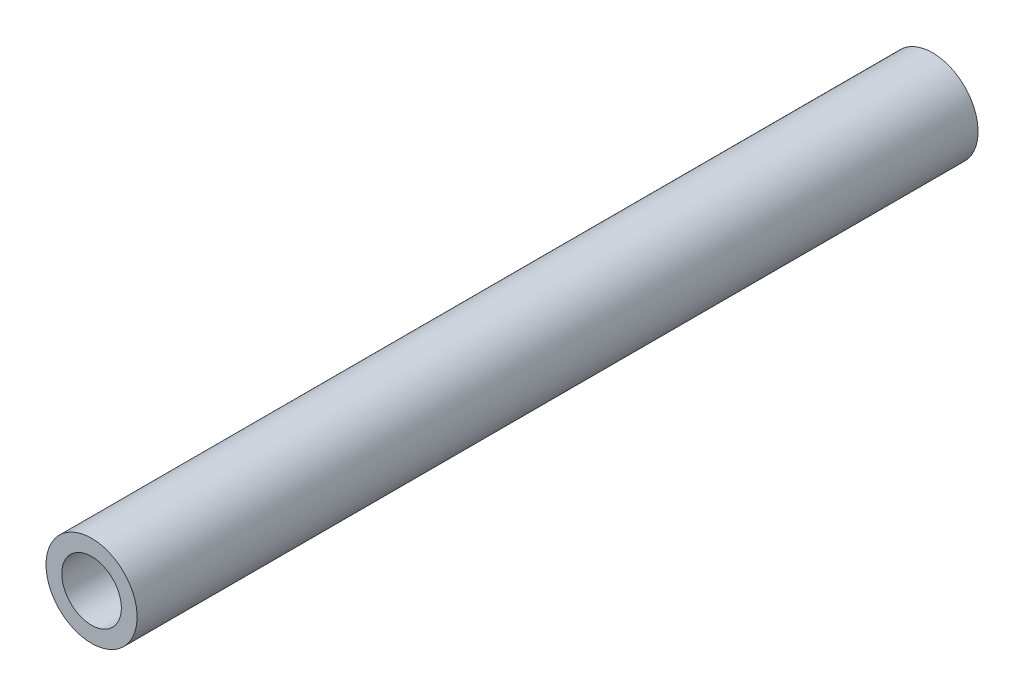
ISO-10303-21;
HEADER;
FILE_DESCRIPTION(('STEP AP214'),'2;1');
FILE_NAME('part.step','',(''),(''),'','','');
FILE_SCHEMA(('AUTOMOTIVE_DESIGN { 1 0 10303 214 1 1 1 1 }'));
ENDSEC;
DATA;
#1=APPLICATION_CONTEXT('core data for automotive mechanical design processes');
#2=APPLICATION_PROTOCOL_DEFINITION('international standard','automotive_design',2000,#1);
#3=PRODUCT_CONTEXT('',#1,'mechanical');
#4=PRODUCT('Part','Part','',(#3));
#5=PRODUCT_RELATED_PRODUCT_CATEGORY('part','',(#4));
#6=PRODUCT_DEFINITION_FORMATION('','',#4);
#7=PRODUCT_DEFINITION_CONTEXT('part definition',#1,'design');
#8=PRODUCT_DEFINITION('design','',#6,#7);
#9=PRODUCT_DEFINITION_SHAPE('','',#8);
#10=(LENGTH_UNIT() NAMED_UNIT(*) SI_UNIT(.MILLI.,.METRE.));
#11=(NAMED_UNIT(*) PLANE_ANGLE_UNIT() SI_UNIT($,.RADIAN.));
#12=(NAMED_UNIT(*) SI_UNIT($,.STERADIAN.) SOLID_ANGLE_UNIT());
#13=UNCERTAINTY_MEASURE_WITH_UNIT(LENGTH_MEASURE(1.E-05),#10,'distance_accuracy_value','');
#14=(GEOMETRIC_REPRESENTATION_CONTEXT(3) GLOBAL_UNCERTAINTY_ASSIGNED_CONTEXT((#13)) GLOBAL_UNIT_ASSIGNED_CONTEXT((#10,
#11,#12)) REPRESENTATION_CONTEXT('',''));
#15=CARTESIAN_POINT('',(0.,0.,0.));
#16=DIRECTION('',(0.,0.,1.));
#17=DIRECTION('',(1.,0.,0.));
#18=AXIS2_PLACEMENT_3D('',#15,#16,#17);
#19=CARTESIAN_POINT('',(0.,0.,304.8));
#20=DIRECTION('',(0.,0.,-1.));
#21=DIRECTION('',(-1.,0.,0.));
#22=AXIS2_PLACEMENT_3D('',#19,#20,#21);
#23=CYLINDRICAL_SURFACE('',#22,16.51);
#24=CARTESIAN_POINT('',(0.,0.,304.8));
#25=DIRECTION('',(0.,0.,1.));
#26=DIRECTION('',(1.,0.,0.));
#27=AXIS2_PLACEMENT_3D('',#24,#25,#26);
#28=CIRCLE('',#27,16.51);
#29=CARTESIAN_POINT('',(-16.51,0.,304.8));
#30=VERTEX_POINT('',#29);
#31=EDGE_CURVE('E10',#30,#30,#28,.T.);
#32=CARTESIAN_POINT('',(0.,0.,0.));
#33=DIRECTION('',(0.,0.,1.));
#34=DIRECTION('',(1.,0.,0.));
#35=AXIS2_PLACEMENT_3D('',#32,#33,#34);
#36=CIRCLE('',#35,16.51);
#37=CARTESIAN_POINT('',(-16.51,0.,0.));
#38=VERTEX_POINT('',#37);
#39=EDGE_CURVE('E42',#38,#38,#36,.T.);
#40=CARTESIAN_POINT('',(-16.51,0.,304.8));
#41=CARTESIAN_POINT('',(-16.51,0.,301.625));
#42=CARTESIAN_POINT('',(-16.51,0.,298.45));
#43=CARTESIAN_POINT('',(-16.51,0.,292.1));
#44=CARTESIAN_POINT('',(-16.51,0.,288.925));
#45=CARTESIAN_POINT('',(-16.51,0.,282.575));
#46=CARTESIAN_POINT('',(-16.51,0.,279.4));
#47=CARTESIAN_POINT('',(-16.51,0.,273.05));
#48=CARTESIAN_POINT('',(-16.51,0.,269.875));
#49=CARTESIAN_POINT('',(-16.51,0.,263.525));
#50=CARTESIAN_POINT('',(-16.51,0.,260.35));
#51=CARTESIAN_POINT('',(-16.51,0.,254.));
#52=CARTESIAN_POINT('',(-16.51,0.,250.825));
#53=CARTESIAN_POINT('',(-16.51,0.,244.475));
#54=CARTESIAN_POINT('',(-16.51,0.,241.3));
#55=CARTESIAN_POINT('',(-16.51,0.,234.95));
#56=CARTESIAN_POINT('',(-16.51,0.,231.775));
#57=CARTESIAN_POINT('',(-16.51,0.,225.425));
#58=CARTESIAN_POINT('',(-16.51,0.,222.25));
#59=CARTESIAN_POINT('',(-16.51,0.,215.9));
#60=CARTESIAN_POINT('',(-16.51,0.,212.725));
#61=CARTESIAN_POINT('',(-16.51,0.,206.375));
#62=CARTESIAN_POINT('',(-16.51,0.,203.2));
#63=CARTESIAN_POINT('',(-16.51,0.,196.85));
#64=CARTESIAN_POINT('',(-16.51,0.,193.675));
#65=CARTESIAN_POINT('',(-16.51,0.,187.325));
#66=CARTESIAN_POINT('',(-16.51,0.,184.15));
#67=CARTESIAN_POINT('',(-16.51,0.,177.8));
#68=CARTESIAN_POINT('',(-16.51,0.,174.625));
#69=CARTESIAN_POINT('',(-16.51,0.,168.275));
#70=CARTESIAN_POINT('',(-16.51,0.,165.1));
#71=CARTESIAN_POINT('',(-16.51,0.,158.75));
#72=CARTESIAN_POINT('',(-16.51,0.,155.575));
#73=CARTESIAN_POINT('',(-16.51,0.,149.225));
#74=CARTESIAN_POINT('',(-16.51,0.,146.05));
#75=CARTESIAN_POINT('',(-16.51,0.,139.7));
#76=CARTESIAN_POINT('',(-16.51,0.,136.525));
#77=CARTESIAN_POINT('',(-16.51,0.,130.175));
#78=CARTESIAN_POINT('',(-16.51,0.,127.));
#79=CARTESIAN_POINT('',(-16.51,0.,120.65));
#80=CARTESIAN_POINT('',(-16.51,0.,117.475));
#81=CARTESIAN_POINT('',(-16.51,0.,111.125));
#82=CARTESIAN_POINT('',(-16.51,0.,107.95));
#83=CARTESIAN_POINT('',(-16.51,0.,101.6));
#84=CARTESIAN_POINT('',(-16.51,0.,98.425));
#85=CARTESIAN_POINT('',(-16.51,0.,92.075));
#86=CARTESIAN_POINT('',(-16.51,0.,88.9));
#87=CARTESIAN_POINT('',(-16.51,0.,82.55));
#88=CARTESIAN_POINT('',(-16.51,0.,79.375));
#89=CARTESIAN_POINT('',(-16.51,0.,73.025));
#90=CARTESIAN_POINT('',(-16.51,0.,69.85));
#91=CARTESIAN_POINT('',(-16.51,0.,63.5));
#92=CARTESIAN_POINT('',(-16.51,0.,60.325));
#93=CARTESIAN_POINT('',(-16.51,0.,53.975));
#94=CARTESIAN_POINT('',(-16.51,0.,50.8));
#95=CARTESIAN_POINT('',(-16.51,0.,44.45));
#96=CARTESIAN_POINT('',(-16.51,0.,41.275));
#97=CARTESIAN_POINT('',(-16.51,0.,34.925));
#98=CARTESIAN_POINT('',(-16.51,0.,31.75));
#99=CARTESIAN_POINT('',(-16.51,0.,25.4));
#100=CARTESIAN_POINT('',(-16.51,0.,22.225));
#101=CARTESIAN_POINT('',(-16.51,0.,15.875));
#102=CARTESIAN_POINT('',(-16.51,0.,12.7));
#103=CARTESIAN_POINT('',(-16.51,0.,6.35));
#104=CARTESIAN_POINT('',(-16.51,0.,3.175));
#105=CARTESIAN_POINT('',(-16.51,0.,0.));
#106=B_SPLINE_CURVE_WITH_KNOTS('',3,(#40,#41,#42,#43,#44,#45,#46,#47,#48,#49,#50,#51,#52,#53,
#54,#55,#56,#57,#58,#59,#60,#61,#62,#63,#64,#65,#66,#67,#68,#69,#70,#71,#72,#73,#74,#75,#76,#77,
#78,#79,#80,#81,#82,#83,#84,#85,#86,#87,#88,#89,#90,#91,#92,#93,#94,#95,#96,#97,#98,#99,#100,
#101,#102,#103,#104,#105),.UNSPECIFIED.,.F.,.F.,(4,2,2,2,2,2,2,2,2,2,2,2,2,2,2,2,2,2,2,2,2,2,2,
2,2,2,2,2,2,2,2,2,4),(0.,9.52499999999995,19.05,28.575,38.1,47.625,57.15,66.675,76.2,85.725,
95.2499999999999,104.775,114.3,123.825,133.35,142.875,152.4,161.925,171.45,180.975,190.5,
200.025,209.55,219.075,228.6,238.125,247.65,257.175,266.7,276.225,285.75,295.275,304.8),.UNSPECIFIED.);
#107=EDGE_CURVE('BSEAM39',#30,#38,#106,.T.);
#108=ORIENTED_EDGE('',*,*,#31,.F.);
#109=ORIENTED_EDGE('',*,*,#39,.T.);
#110=ORIENTED_EDGE('',*,*,#107,.T.);
#111=ORIENTED_EDGE('',*,*,#107,.F.);
#112=EDGE_LOOP('',(#108,#110,#109,#111));
#113=FACE_BOUND('',#112,.T.);
#114=ADVANCED_FACE('F39',(#113),#23,.T.);
#115=CARTESIAN_POINT('',(0.,0.,304.8));
#116=DIRECTION('',(0.,0.,1.));
#117=DIRECTION('',(1.,0.,0.));
#118=AXIS2_PLACEMENT_3D('',#115,#116,#117);
#119=PLANE('',#118);
#120=CARTESIAN_POINT('',(0.,0.,304.8));
#121=DIRECTION('',(0.,0.,-1.));
#122=DIRECTION('',(-1.,0.,0.));
#123=AXIS2_PLACEMENT_3D('',#120,#121,#122);
#124=CIRCLE('',#123,10.795);
#125=CARTESIAN_POINT('',(-10.795,0.,304.8));
#126=VERTEX_POINT('',#125);
#127=EDGE_CURVE('E51',#126,#126,#124,.T.);
#128=ORIENTED_EDGE('',*,*,#127,.T.);
#129=EDGE_LOOP('',(#128));
#130=FACE_BOUND('',#129,.T.);
#131=ORIENTED_EDGE('',*,*,#31,.T.);
#132=EDGE_LOOP('',(#131));
#133=FACE_BOUND('',#132,.T.);
#134=ADVANCED_FACE('F61',(#130,#133),#119,.T.);
#135=CARTESIAN_POINT('',(0.,0.,0.));
#136=DIRECTION('',(0.,0.,1.));
#137=DIRECTION('',(1.,0.,0.));
#138=AXIS2_PLACEMENT_3D('',#135,#136,#137);
#139=PLANE('',#138);
#140=CARTESIAN_POINT('',(0.,0.,0.));
#141=DIRECTION('',(0.,0.,-1.));
#142=DIRECTION('',(-1.,0.,0.));
#143=AXIS2_PLACEMENT_3D('',#140,#141,#142);
#144=CIRCLE('',#143,10.795);
#145=CARTESIAN_POINT('',(-10.795,0.,0.));
#146=VERTEX_POINT('',#145);
#147=EDGE_CURVE('E53',#146,#146,#144,.T.);
#148=ORIENTED_EDGE('',*,*,#147,.F.);
#149=EDGE_LOOP('',(#148));
#150=FACE_BOUND('',#149,.T.);
#151=ORIENTED_EDGE('',*,*,#39,.F.);
#152=EDGE_LOOP('',(#151));
#153=FACE_BOUND('',#152,.T.);
#154=ADVANCED_FACE('F66',(#150,#153),#139,.F.);
#155=CARTESIAN_POINT('',(0.,0.,304.8));
#156=DIRECTION('',(0.,0.,-1.));
#157=DIRECTION('',(-1.,0.,0.));
#158=AXIS2_PLACEMENT_3D('',#155,#156,#157);
#159=CYLINDRICAL_SURFACE('',#158,10.795);
#160=CARTESIAN_POINT('',(-10.795,0.,304.8));
#161=CARTESIAN_POINT('',(-10.795,0.,301.625));
#162=CARTESIAN_POINT('',(-10.795,0.,298.45));
#163=CARTESIAN_POINT('',(-10.795,0.,292.1));
#164=CARTESIAN_POINT('',(-10.795,0.,288.925));
#165=CARTESIAN_POINT('',(-10.795,0.,282.575));
#166=CARTESIAN_POINT('',(-10.795,0.,279.4));
#167=CARTESIAN_POINT('',(-10.795,0.,273.05));
#168=CARTESIAN_POINT('',(-10.795,0.,269.875));
#169=CARTESIAN_POINT('',(-10.795,0.,263.525));
#170=CARTESIAN_POINT('',(-10.795,0.,260.35));
#171=CARTESIAN_POINT('',(-10.795,0.,254.));
#172=CARTESIAN_POINT('',(-10.795,0.,250.825));
#173=CARTESIAN_POINT('',(-10.795,0.,244.475));
#174=CARTESIAN_POINT('',(-10.795,0.,241.3));
#175=CARTESIAN_POINT('',(-10.795,0.,234.95));
#176=CARTESIAN_POINT('',(-10.795,0.,231.775));
#177=CARTESIAN_POINT('',(-10.795,0.,225.425));
#178=CARTESIAN_POINT('',(-10.795,0.,222.25));
#179=CARTESIAN_POINT('',(-10.795,0.,215.9));
#180=CARTESIAN_POINT('',(-10.795,0.,212.725));
#181=CARTESIAN_POINT('',(-10.795,0.,206.375));
#182=CARTESIAN_POINT('',(-10.795,0.,203.2));
#183=CARTESIAN_POINT('',(-10.795,0.,196.85));
#184=CARTESIAN_POINT('',(-10.795,0.,193.675));
#185=CARTESIAN_POINT('',(-10.795,0.,187.325));
#186=CARTESIAN_POINT('',(-10.795,0.,184.15));
#187=CARTESIAN_POINT('',(-10.795,0.,177.8));
#188=CARTESIAN_POINT('',(-10.795,0.,174.625));
#189=CARTESIAN_POINT('',(-10.795,0.,168.275));
#190=CARTESIAN_POINT('',(-10.795,0.,165.1));
#191=CARTESIAN_POINT('',(-10.795,0.,158.75));
#192=CARTESIAN_POINT('',(-10.795,0.,155.575));
#193=CARTESIAN_POINT('',(-10.795,0.,149.225));
#194=CARTESIAN_POINT('',(-10.795,0.,146.05));
#195=CARTESIAN_POINT('',(-10.795,0.,139.7));
#196=CARTESIAN_POINT('',(-10.795,0.,136.525));
#197=CARTESIAN_POINT('',(-10.795,0.,130.175));
#198=CARTESIAN_POINT('',(-10.795,0.,127.));
#199=CARTESIAN_POINT('',(-10.795,0.,120.65));
#200=CARTESIAN_POINT('',(-10.795,0.,117.475));
#201=CARTESIAN_POINT('',(-10.795,0.,111.125));
#202=CARTESIAN_POINT('',(-10.795,0.,107.95));
#203=CARTESIAN_POINT('',(-10.795,0.,101.6));
#204=CARTESIAN_POINT('',(-10.795,0.,98.425));
#205=CARTESIAN_POINT('',(-10.795,0.,92.075));
#206=CARTESIAN_POINT('',(-10.795,0.,88.9));
#207=CARTESIAN_POINT('',(-10.795,0.,82.55));
#208=CARTESIAN_POINT('',(-10.795,0.,79.375));
#209=CARTESIAN_POINT('',(-10.795,0.,73.025));
#210=CARTESIAN_POINT('',(-10.795,0.,69.85));
#211=CARTESIAN_POINT('',(-10.795,0.,63.5));
#212=CARTESIAN_POINT('',(-10.795,0.,60.325));
#213=CARTESIAN_POINT('',(-10.795,0.,53.975));
#214=CARTESIAN_POINT('',(-10.795,0.,50.8));
#215=CARTESIAN_POINT('',(-10.795,0.,44.45));
#216=CARTESIAN_POINT('',(-10.795,0.,41.275));
#217=CARTESIAN_POINT('',(-10.795,0.,34.925));
#218=CARTESIAN_POINT('',(-10.795,0.,31.75));
#219=CARTESIAN_POINT('',(-10.795,0.,25.4));
#220=CARTESIAN_POINT('',(-10.795,0.,22.225));
#221=CARTESIAN_POINT('',(-10.795,0.,15.875));
#222=CARTESIAN_POINT('',(-10.795,0.,12.7));
#223=CARTESIAN_POINT('',(-10.795,0.,6.35));
#224=CARTESIAN_POINT('',(-10.795,0.,3.175));
#225=CARTESIAN_POINT('',(-10.795,0.,0.));
#226=B_SPLINE_CURVE_WITH_KNOTS('',3,(#160,#161,#162,#163,#164,#165,#166,#167,#168,#169,#170,
#171,#172,#173,#174,#175,#176,#177,#178,#179,#180,#181,#182,#183,#184,#185,#186,#187,#188,#189,
#190,#191,#192,#193,#194,#195,#196,#197,#198,#199,#200,#201,#202,#203,#204,#205,#206,#207,#208,
#209,#210,#211,#212,#213,#214,#215,#216,#217,#218,#219,#220,#221,#222,#223,#224,#225),
.UNSPECIFIED.,.F.,.F.,(4,2,2,2,2,2,2,2,2,2,2,2,2,2,2,2,2,2,2,2,2,2,2,2,2,2,2,2,2,2,2,2,4),(0.,
9.52499999999995,19.05,28.575,38.1,47.625,57.15,66.675,76.2,85.725,95.25,104.775,114.3,123.825,
133.35,142.875,152.4,161.925,171.45,180.975,190.5,200.025,209.55,219.075,228.6,238.125,247.65,
257.175,266.7,276.225,285.75,295.275,304.8),.UNSPECIFIED.);
#227=EDGE_CURVE('BSEAM63',#126,#146,#226,.T.);
#228=ORIENTED_EDGE('',*,*,#127,.F.);
#229=ORIENTED_EDGE('',*,*,#147,.T.);
#230=ORIENTED_EDGE('',*,*,#227,.T.);
#231=ORIENTED_EDGE('',*,*,#227,.F.);
#232=EDGE_LOOP('',(#228,#230,#229,#231));
#233=FACE_BOUND('',#232,.T.);
#234=ADVANCED_FACE('F63',(#233),#159,.F.);
#235=CLOSED_SHELL('',(#114,#134,#154,#234));
#236=MANIFOLD_SOLID_BREP('B2',#235);
#237=ADVANCED_BREP_SHAPE_REPRESENTATION('',(#18,#236),#14);
#238=SHAPE_DEFINITION_REPRESENTATION(#9,#237);
ENDSEC;
END-ISO-10303-21;
